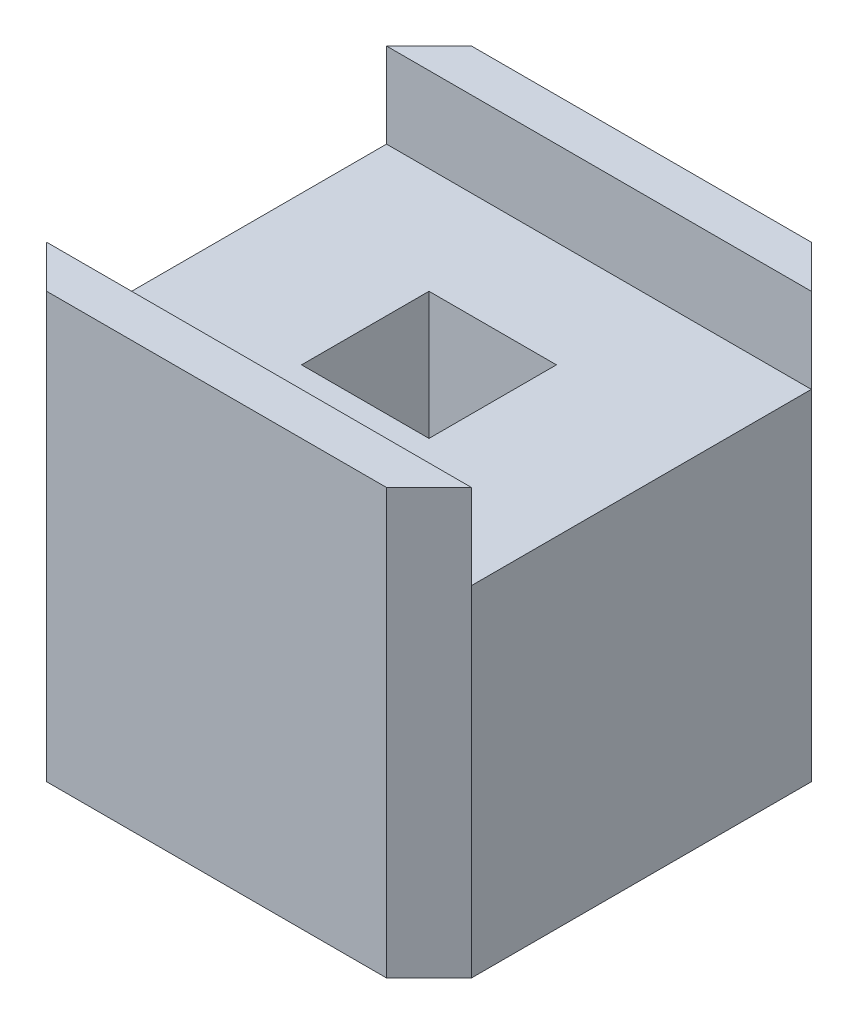
ISO-10303-21;
HEADER;
FILE_DESCRIPTION(('STEP AP214'),'2;1');
FILE_NAME('part.step','',(''),(''),'','','');
FILE_SCHEMA(('AUTOMOTIVE_DESIGN { 1 0 10303 214 1 1 1 1 }'));
ENDSEC;
DATA;
#1=APPLICATION_CONTEXT('core data for automotive mechanical design processes');
#2=APPLICATION_PROTOCOL_DEFINITION('international standard','automotive_design',2000,#1);
#3=PRODUCT_CONTEXT('',#1,'mechanical');
#4=PRODUCT('Part','Part','',(#3));
#5=PRODUCT_RELATED_PRODUCT_CATEGORY('part','',(#4));
#6=PRODUCT_DEFINITION_FORMATION('','',#4);
#7=PRODUCT_DEFINITION_CONTEXT('part definition',#1,'design');
#8=PRODUCT_DEFINITION('design','',#6,#7);
#9=PRODUCT_DEFINITION_SHAPE('','',#8);
#10=(LENGTH_UNIT() NAMED_UNIT(*) SI_UNIT(.MILLI.,.METRE.));
#11=(NAMED_UNIT(*) PLANE_ANGLE_UNIT() SI_UNIT($,.RADIAN.));
#12=(NAMED_UNIT(*) SI_UNIT($,.STERADIAN.) SOLID_ANGLE_UNIT());
#13=UNCERTAINTY_MEASURE_WITH_UNIT(LENGTH_MEASURE(1.E-05),#10,'distance_accuracy_value','');
#14=(GEOMETRIC_REPRESENTATION_CONTEXT(3) GLOBAL_UNCERTAINTY_ASSIGNED_CONTEXT((#13)) GLOBAL_UNIT_ASSIGNED_CONTEXT((#10,
#11,#12)) REPRESENTATION_CONTEXT('',''));
#15=CARTESIAN_POINT('',(0.,0.,0.));
#16=DIRECTION('',(0.,0.,1.));
#17=DIRECTION('',(1.,0.,0.));
#18=AXIS2_PLACEMENT_3D('',#15,#16,#17);
#19=CARTESIAN_POINT('',(0.,2.5,0.));
#20=DIRECTION('',(0.,-1.,0.));
#21=DIRECTION('',(0.,0.,-1.));
#22=AXIS2_PLACEMENT_3D('',#19,#20,#21);
#23=PLANE('',#22);
#24=DIRECTION('',(-0.707106781186548,0.,0.707106781186548));
#25=VECTOR('',#24,1.);
#26=CARTESIAN_POINT('',(-1.25,2.5,-1.));
#27=LINE('',#26,#25);
#28=CARTESIAN_POINT('',(-1.,2.5,-1.25));
#29=VERTEX_POINT('',#28);
#30=CARTESIAN_POINT('',(-1.25,2.5,-1.));
#31=VERTEX_POINT('',#30);
#32=EDGE_CURVE('E217',#29,#31,#27,.T.);
#33=ORIENTED_EDGE('',*,*,#32,.T.);
#34=DIRECTION('',(-1.,0.,0.));
#35=VECTOR('',#34,1.);
#36=CARTESIAN_POINT('',(-1.25,2.5,-1.));
#37=LINE('',#36,#35);
#38=CARTESIAN_POINT('',(1.25,2.5,-1.));
#39=VERTEX_POINT('',#38);
#40=EDGE_CURVE('E183',#39,#31,#37,.T.);
#41=ORIENTED_EDGE('',*,*,#40,.F.);
#42=DIRECTION('',(-0.707106781186548,0.,-0.707106781186548));
#43=VECTOR('',#42,1.);
#44=CARTESIAN_POINT('',(1.,2.5,-1.25));
#45=LINE('',#44,#43);
#46=CARTESIAN_POINT('',(1.,2.5,-1.25));
#47=VERTEX_POINT('',#46);
#48=EDGE_CURVE('E235',#39,#47,#45,.T.);
#49=ORIENTED_EDGE('',*,*,#48,.T.);
#50=DIRECTION('',(-1.,0.,0.));
#51=VECTOR('',#50,1.);
#52=CARTESIAN_POINT('',(-1.,2.5,-1.25));
#53=LINE('',#52,#51);
#54=EDGE_CURVE('E256',#47,#29,#53,.T.);
#55=ORIENTED_EDGE('',*,*,#54,.T.);
#56=EDGE_LOOP('',(#33,#41,#49,#55));
#57=FACE_BOUND('',#56,.T.);
#58=ADVANCED_FACE('F45',(#57),#23,.F.);
#59=CARTESIAN_POINT('',(-1.25,2.5,-1.));
#60=DIRECTION('',(1.,0.,0.));
#61=DIRECTION('',(0.,0.,-1.));
#62=AXIS2_PLACEMENT_3D('',#59,#60,#61);
#63=PLANE('',#62);
#64=DIRECTION('',(0.,0.,1.));
#65=VECTOR('',#64,1.);
#66=CARTESIAN_POINT('',(-1.25,2.,-1.));
#67=LINE('',#66,#65);
#68=CARTESIAN_POINT('',(-1.25,2.,-1.));
#69=VERTEX_POINT('',#68);
#70=CARTESIAN_POINT('',(-1.25,2.,1.));
#71=VERTEX_POINT('',#70);
#72=EDGE_CURVE('E175',#69,#71,#67,.T.);
#73=ORIENTED_EDGE('',*,*,#72,.F.);
#74=DIRECTION('',(0.,-1.,0.));
#75=VECTOR('',#74,1.);
#76=CARTESIAN_POINT('',(-1.25,2.5,-1.));
#77=LINE('',#76,#75);
#78=CARTESIAN_POINT('',(-1.25,0.,-1.));
#79=VERTEX_POINT('',#78);
#80=EDGE_CURVE('E200',#69,#79,#77,.T.);
#81=ORIENTED_EDGE('',*,*,#80,.T.);
#82=DIRECTION('',(0.,0.,1.));
#83=VECTOR('',#82,1.);
#84=CARTESIAN_POINT('',(-1.25,0.,-1.));
#85=LINE('',#84,#83);
#86=CARTESIAN_POINT('',(-1.25,0.,1.));
#87=VERTEX_POINT('',#86);
#88=EDGE_CURVE('E189',#79,#87,#85,.T.);
#89=ORIENTED_EDGE('',*,*,#88,.T.);
#90=DIRECTION('',(0.,-1.,0.));
#91=VECTOR('',#90,1.);
#92=CARTESIAN_POINT('',(-1.25,2.5,1.));
#93=LINE('',#92,#91);
#94=EDGE_CURVE('E186',#71,#87,#93,.T.);
#95=ORIENTED_EDGE('',*,*,#94,.F.);
#96=EDGE_LOOP('',(#73,#81,#89,#95));
#97=FACE_BOUND('',#96,.T.);
#98=ADVANCED_FACE('F187',(#97),#63,.F.);
#99=CARTESIAN_POINT('',(1.25,2.5,-1.));
#100=DIRECTION('',(-1.,0.,0.));
#101=DIRECTION('',(0.,0.,1.));
#102=AXIS2_PLACEMENT_3D('',#99,#100,#101);
#103=PLANE('',#102);
#104=DIRECTION('',(0.,0.,-1.));
#105=VECTOR('',#104,1.);
#106=CARTESIAN_POINT('',(1.25,2.,-1.));
#107=LINE('',#106,#105);
#108=CARTESIAN_POINT('',(1.25,2.,1.));
#109=VERTEX_POINT('',#108);
#110=CARTESIAN_POINT('',(1.25,2.,-1.));
#111=VERTEX_POINT('',#110);
#112=EDGE_CURVE('E174',#109,#111,#107,.T.);
#113=ORIENTED_EDGE('',*,*,#112,.F.);
#114=DIRECTION('',(0.,-1.,0.));
#115=VECTOR('',#114,1.);
#116=CARTESIAN_POINT('',(1.25,2.5,1.));
#117=LINE('',#116,#115);
#118=CARTESIAN_POINT('',(1.25,0.,1.));
#119=VERTEX_POINT('',#118);
#120=EDGE_CURVE('E262',#109,#119,#117,.T.);
#121=ORIENTED_EDGE('',*,*,#120,.T.);
#122=DIRECTION('',(0.,0.,-1.));
#123=VECTOR('',#122,1.);
#124=CARTESIAN_POINT('',(1.25,0.,-1.));
#125=LINE('',#124,#123);
#126=CARTESIAN_POINT('',(1.25,0.,-1.));
#127=VERTEX_POINT('',#126);
#128=EDGE_CURVE('E250',#119,#127,#125,.T.);
#129=ORIENTED_EDGE('',*,*,#128,.T.);
#130=DIRECTION('',(0.,-1.,0.));
#131=VECTOR('',#130,1.);
#132=CARTESIAN_POINT('',(1.25,2.5,-1.));
#133=LINE('',#132,#131);
#134=EDGE_CURVE('E258',#111,#127,#133,.T.);
#135=ORIENTED_EDGE('',*,*,#134,.F.);
#136=EDGE_LOOP('',(#113,#121,#129,#135));
#137=FACE_BOUND('',#136,.T.);
#138=ADVANCED_FACE('F340',(#137),#103,.F.);
#139=CARTESIAN_POINT('',(0.374999999999999,2.5,-0.375));
#140=DIRECTION('',(-1.,0.,0.));
#141=DIRECTION('',(0.,0.,1.));
#142=AXIS2_PLACEMENT_3D('',#139,#140,#141);
#143=PLANE('',#142);
#144=DIRECTION('',(0.,-1.,0.));
#145=VECTOR('',#144,1.);
#146=CARTESIAN_POINT('',(0.374999999999999,2.5,0.375));
#147=LINE('',#146,#145);
#148=CARTESIAN_POINT('',(0.374999999999999,2.,0.375));
#149=VERTEX_POINT('',#148);
#150=CARTESIAN_POINT('',(0.374999999999999,0.,0.375));
#151=VERTEX_POINT('',#150);
#152=EDGE_CURVE('E318',#149,#151,#147,.T.);
#153=ORIENTED_EDGE('',*,*,#152,.F.);
#154=DIRECTION('',(0.,0.,-1.));
#155=VECTOR('',#154,1.);
#156=CARTESIAN_POINT('',(0.374999999999999,2.,-0.375));
#157=LINE('',#156,#155);
#158=CARTESIAN_POINT('',(0.374999999999999,2.,-0.375));
#159=VERTEX_POINT('',#158);
#160=EDGE_CURVE('E72',#149,#159,#157,.T.);
#161=ORIENTED_EDGE('',*,*,#160,.T.);
#162=DIRECTION('',(0.,-1.,0.));
#163=VECTOR('',#162,1.);
#164=CARTESIAN_POINT('',(0.374999999999999,2.5,-0.375));
#165=LINE('',#164,#163);
#166=CARTESIAN_POINT('',(0.374999999999999,0.,-0.375));
#167=VERTEX_POINT('',#166);
#168=EDGE_CURVE('E228',#159,#167,#165,.T.);
#169=ORIENTED_EDGE('',*,*,#168,.T.);
#170=DIRECTION('',(0.,0.,-1.));
#171=VECTOR('',#170,1.);
#172=CARTESIAN_POINT('',(0.374999999999999,0.,-0.375));
#173=LINE('',#172,#171);
#174=EDGE_CURVE('E287',#151,#167,#173,.T.);
#175=ORIENTED_EDGE('',*,*,#174,.F.);
#176=EDGE_LOOP('',(#153,#161,#169,#175));
#177=FACE_BOUND('',#176,.T.);
#178=ADVANCED_FACE('F342',(#177),#143,.T.);
#179=CARTESIAN_POINT('',(-0.375000000000001,2.5,-0.375));
#180=DIRECTION('',(0.,0.,1.));
#181=DIRECTION('',(1.,0.,0.));
#182=AXIS2_PLACEMENT_3D('',#179,#180,#181);
#183=PLANE('',#182);
#184=ORIENTED_EDGE('',*,*,#168,.F.);
#185=DIRECTION('',(-1.,0.,0.));
#186=VECTOR('',#185,1.);
#187=CARTESIAN_POINT('',(-0.375000000000001,2.,-0.375));
#188=LINE('',#187,#186);
#189=CARTESIAN_POINT('',(-0.375000000000001,2.,-0.375));
#190=VERTEX_POINT('',#189);
#191=EDGE_CURVE('E288',#159,#190,#188,.T.);
#192=ORIENTED_EDGE('',*,*,#191,.T.);
#193=DIRECTION('',(0.,-1.,0.));
#194=VECTOR('',#193,1.);
#195=CARTESIAN_POINT('',(-0.375000000000001,2.5,-0.375));
#196=LINE('',#195,#194);
#197=CARTESIAN_POINT('',(-0.375000000000001,0.,-0.375));
#198=VERTEX_POINT('',#197);
#199=EDGE_CURVE('E232',#190,#198,#196,.T.);
#200=ORIENTED_EDGE('',*,*,#199,.T.);
#201=DIRECTION('',(-1.,0.,0.));
#202=VECTOR('',#201,1.);
#203=CARTESIAN_POINT('',(-0.375000000000001,0.,-0.375));
#204=LINE('',#203,#202);
#205=EDGE_CURVE('E306',#167,#198,#204,.T.);
#206=ORIENTED_EDGE('',*,*,#205,.F.);
#207=EDGE_LOOP('',(#184,#192,#200,#206));
#208=FACE_BOUND('',#207,.T.);
#209=ADVANCED_FACE('F348',(#208),#183,.T.);
#210=CARTESIAN_POINT('',(-0.375000000000001,2.5,-0.375));
#211=DIRECTION('',(1.,0.,0.));
#212=DIRECTION('',(0.,0.,-1.));
#213=AXIS2_PLACEMENT_3D('',#210,#211,#212);
#214=PLANE('',#213);
#215=ORIENTED_EDGE('',*,*,#199,.F.);
#216=DIRECTION('',(0.,0.,1.));
#217=VECTOR('',#216,1.);
#218=CARTESIAN_POINT('',(-0.375000000000001,2.,-0.375));
#219=LINE('',#218,#217);
#220=CARTESIAN_POINT('',(-0.375,2.,0.375));
#221=VERTEX_POINT('',#220);
#222=EDGE_CURVE('E290',#190,#221,#219,.T.);
#223=ORIENTED_EDGE('',*,*,#222,.T.);
#224=DIRECTION('',(0.,-1.,0.));
#225=VECTOR('',#224,1.);
#226=CARTESIAN_POINT('',(-0.375,2.5,0.375));
#227=LINE('',#226,#225);
#228=CARTESIAN_POINT('',(-0.375,0.,0.375));
#229=VERTEX_POINT('',#228);
#230=EDGE_CURVE('E321',#221,#229,#227,.T.);
#231=ORIENTED_EDGE('',*,*,#230,.T.);
#232=DIRECTION('',(0.,0.,1.));
#233=VECTOR('',#232,1.);
#234=CARTESIAN_POINT('',(-0.375000000000001,0.,-0.375));
#235=LINE('',#234,#233);
#236=EDGE_CURVE('E310',#198,#229,#235,.T.);
#237=ORIENTED_EDGE('',*,*,#236,.F.);
#238=EDGE_LOOP('',(#215,#223,#231,#237));
#239=FACE_BOUND('',#238,.T.);
#240=ADVANCED_FACE('F366',(#239),#214,.T.);
#241=CARTESIAN_POINT('',(-0.375,2.5,0.375));
#242=DIRECTION('',(0.,0.,-1.));
#243=DIRECTION('',(-1.,0.,0.));
#244=AXIS2_PLACEMENT_3D('',#241,#242,#243);
#245=PLANE('',#244);
#246=ORIENTED_EDGE('',*,*,#230,.F.);
#247=DIRECTION('',(1.,0.,0.));
#248=VECTOR('',#247,1.);
#249=CARTESIAN_POINT('',(-0.375,2.,0.375));
#250=LINE('',#249,#248);
#251=EDGE_CURVE('E11',#221,#149,#250,.T.);
#252=ORIENTED_EDGE('',*,*,#251,.T.);
#253=ORIENTED_EDGE('',*,*,#152,.T.);
#254=DIRECTION('',(1.,0.,0.));
#255=VECTOR('',#254,1.);
#256=CARTESIAN_POINT('',(-0.375,0.,0.375));
#257=LINE('',#256,#255);
#258=EDGE_CURVE('E314',#229,#151,#257,.T.);
#259=ORIENTED_EDGE('',*,*,#258,.F.);
#260=EDGE_LOOP('',(#246,#252,#253,#259));
#261=FACE_BOUND('',#260,.T.);
#262=ADVANCED_FACE('F361',(#261),#245,.T.);
#263=DIRECTION('',(0.707106781186548,0.,-0.707106781186548));
#264=VECTOR('',#263,1.);
#265=CARTESIAN_POINT('',(1.,2.5,1.25));
#266=LINE('',#265,#264);
#267=CARTESIAN_POINT('',(1.,2.5,1.25));
#268=VERTEX_POINT('',#267);
#269=CARTESIAN_POINT('',(1.25,2.5,1.));
#270=VERTEX_POINT('',#269);
#271=EDGE_CURVE('E331',#268,#270,#266,.T.);
#272=ORIENTED_EDGE('',*,*,#271,.T.);
#273=DIRECTION('',(1.,0.,0.));
#274=VECTOR('',#273,1.);
#275=CARTESIAN_POINT('',(-1.25,2.5,1.));
#276=LINE('',#275,#274);
#277=CARTESIAN_POINT('',(-1.25,2.5,1.));
#278=VERTEX_POINT('',#277);
#279=EDGE_CURVE('E395',#278,#270,#276,.T.);
#280=ORIENTED_EDGE('',*,*,#279,.F.);
#281=DIRECTION('',(0.707106781186548,0.,0.707106781186548));
#282=VECTOR('',#281,1.);
#283=CARTESIAN_POINT('',(-1.25,2.5,1.));
#284=LINE('',#283,#282);
#285=CARTESIAN_POINT('',(-1.,2.5,1.25));
#286=VERTEX_POINT('',#285);
#287=EDGE_CURVE('E198',#278,#286,#284,.T.);
#288=ORIENTED_EDGE('',*,*,#287,.T.);
#289=DIRECTION('',(1.,0.,0.));
#290=VECTOR('',#289,1.);
#291=CARTESIAN_POINT('',(-1.,2.5,1.25));
#292=LINE('',#291,#290);
#293=EDGE_CURVE('E277',#286,#268,#292,.T.);
#294=ORIENTED_EDGE('',*,*,#293,.T.);
#295=EDGE_LOOP('',(#272,#280,#288,#294));
#296=FACE_BOUND('',#295,.T.);
#297=ADVANCED_FACE('F356',(#296),#23,.F.);
#298=CARTESIAN_POINT('',(0.,0.,0.));
#299=DIRECTION('',(0.,-1.,0.));
#300=DIRECTION('',(0.,0.,-1.));
#301=AXIS2_PLACEMENT_3D('',#298,#299,#300);
#302=PLANE('',#301);
#303=DIRECTION('',(-1.,0.,0.));
#304=VECTOR('',#303,1.);
#305=CARTESIAN_POINT('',(-1.,0.,-1.25));
#306=LINE('',#305,#304);
#307=CARTESIAN_POINT('',(1.,0.,-1.25));
#308=VERTEX_POINT('',#307);
#309=CARTESIAN_POINT('',(-1.,0.,-1.25));
#310=VERTEX_POINT('',#309);
#311=EDGE_CURVE('E223',#308,#310,#306,.T.);
#312=ORIENTED_EDGE('',*,*,#311,.F.);
#313=DIRECTION('',(-0.707106781186548,0.,-0.707106781186548));
#314=VECTOR('',#313,1.);
#315=CARTESIAN_POINT('',(1.,0.,-1.25));
#316=LINE('',#315,#314);
#317=EDGE_CURVE('E254',#127,#308,#316,.T.);
#318=ORIENTED_EDGE('',*,*,#317,.F.);
#319=ORIENTED_EDGE('',*,*,#128,.F.);
#320=DIRECTION('',(0.707106781186548,0.,-0.707106781186548));
#321=VECTOR('',#320,1.);
#322=CARTESIAN_POINT('',(1.,0.,1.25));
#323=LINE('',#322,#321);
#324=CARTESIAN_POINT('',(1.,0.,1.25));
#325=VERTEX_POINT('',#324);
#326=EDGE_CURVE('E246',#325,#119,#323,.T.);
#327=ORIENTED_EDGE('',*,*,#326,.F.);
#328=DIRECTION('',(1.,0.,0.));
#329=VECTOR('',#328,1.);
#330=CARTESIAN_POINT('',(-1.,0.,1.25));
#331=LINE('',#330,#329);
#332=CARTESIAN_POINT('',(-1.,0.,1.25));
#333=VERTEX_POINT('',#332);
#334=EDGE_CURVE('E243',#333,#325,#331,.T.);
#335=ORIENTED_EDGE('',*,*,#334,.F.);
#336=DIRECTION('',(0.707106781186548,0.,0.707106781186548));
#337=VECTOR('',#336,1.);
#338=CARTESIAN_POINT('',(-1.25,0.,1.));
#339=LINE('',#338,#337);
#340=EDGE_CURVE('E240',#87,#333,#339,.T.);
#341=ORIENTED_EDGE('',*,*,#340,.F.);
#342=ORIENTED_EDGE('',*,*,#88,.F.);
#343=DIRECTION('',(-0.707106781186548,0.,0.707106781186548));
#344=VECTOR('',#343,1.);
#345=CARTESIAN_POINT('',(-1.25,0.,-1.));
#346=LINE('',#345,#344);
#347=EDGE_CURVE('E214',#310,#79,#346,.T.);
#348=ORIENTED_EDGE('',*,*,#347,.F.);
#349=EDGE_LOOP('',(#312,#318,#319,#327,#335,#341,#342,#348));
#350=FACE_BOUND('',#349,.T.);
#351=ORIENTED_EDGE('',*,*,#258,.T.);
#352=ORIENTED_EDGE('',*,*,#174,.T.);
#353=ORIENTED_EDGE('',*,*,#205,.T.);
#354=ORIENTED_EDGE('',*,*,#236,.T.);
#355=EDGE_LOOP('',(#351,#352,#353,#354));
#356=FACE_BOUND('',#355,.T.);
#357=ADVANCED_FACE('F278',(#350,#356),#302,.T.);
#358=CARTESIAN_POINT('',(-1.,2.5,-1.25));
#359=DIRECTION('',(0.,0.,1.));
#360=DIRECTION('',(1.,0.,0.));
#361=AXIS2_PLACEMENT_3D('',#358,#359,#360);
#362=PLANE('',#361);
#363=ORIENTED_EDGE('',*,*,#311,.T.);
#364=DIRECTION('',(0.,-1.,0.));
#365=VECTOR('',#364,1.);
#366=CARTESIAN_POINT('',(-1.,2.5,-1.25));
#367=LINE('',#366,#365);
#368=EDGE_CURVE('E54',#29,#310,#367,.T.);
#369=ORIENTED_EDGE('',*,*,#368,.F.);
#370=ORIENTED_EDGE('',*,*,#54,.F.);
#371=DIRECTION('',(0.,-1.,0.));
#372=VECTOR('',#371,1.);
#373=CARTESIAN_POINT('',(1.,2.5,-1.25));
#374=LINE('',#373,#372);
#375=EDGE_CURVE('E225',#47,#308,#374,.T.);
#376=ORIENTED_EDGE('',*,*,#375,.T.);
#377=EDGE_LOOP('',(#363,#369,#370,#376));
#378=FACE_BOUND('',#377,.T.);
#379=ADVANCED_FACE('F47',(#378),#362,.F.);
#380=CARTESIAN_POINT('',(-1.25,2.5,-1.));
#381=DIRECTION('',(0.707106781186548,0.,0.707106781186548));
#382=DIRECTION('',(0.707106781186548,0.,-0.707106781186548));
#383=AXIS2_PLACEMENT_3D('',#380,#381,#382);
#384=PLANE('',#383);
#385=ORIENTED_EDGE('',*,*,#347,.T.);
#386=ORIENTED_EDGE('',*,*,#80,.F.);
#387=EDGE_CURVE('E202',#31,#69,#77,.T.);
#388=ORIENTED_EDGE('',*,*,#387,.F.);
#389=ORIENTED_EDGE('',*,*,#32,.F.);
#390=ORIENTED_EDGE('',*,*,#368,.T.);
#391=EDGE_LOOP('',(#385,#386,#388,#389,#390));
#392=FACE_BOUND('',#391,.T.);
#393=ADVANCED_FACE('F213',(#392),#384,.F.);
#394=CARTESIAN_POINT('',(-1.25,2.5,1.));
#395=DIRECTION('',(0.707106781186548,0.,-0.707106781186548));
#396=DIRECTION('',(-0.707106781186548,0.,-0.707106781186548));
#397=AXIS2_PLACEMENT_3D('',#394,#395,#396);
#398=PLANE('',#397);
#399=ORIENTED_EDGE('',*,*,#340,.T.);
#400=DIRECTION('',(0.,-1.,0.));
#401=VECTOR('',#400,1.);
#402=CARTESIAN_POINT('',(-1.,2.5,1.25));
#403=LINE('',#402,#401);
#404=EDGE_CURVE('E193',#286,#333,#403,.T.);
#405=ORIENTED_EDGE('',*,*,#404,.F.);
#406=ORIENTED_EDGE('',*,*,#287,.F.);
#407=EDGE_CURVE('E167',#278,#71,#93,.T.);
#408=ORIENTED_EDGE('',*,*,#407,.T.);
#409=ORIENTED_EDGE('',*,*,#94,.T.);
#410=EDGE_LOOP('',(#399,#405,#406,#408,#409));
#411=FACE_BOUND('',#410,.T.);
#412=ADVANCED_FACE('F196',(#411),#398,.F.);
#413=CARTESIAN_POINT('',(-1.,2.5,1.25));
#414=DIRECTION('',(0.,0.,-1.));
#415=DIRECTION('',(-1.,0.,0.));
#416=AXIS2_PLACEMENT_3D('',#413,#414,#415);
#417=PLANE('',#416);
#418=ORIENTED_EDGE('',*,*,#334,.T.);
#419=DIRECTION('',(0.,-1.,0.));
#420=VECTOR('',#419,1.);
#421=CARTESIAN_POINT('',(1.,2.5,1.25));
#422=LINE('',#421,#420);
#423=EDGE_CURVE('E264',#268,#325,#422,.T.);
#424=ORIENTED_EDGE('',*,*,#423,.F.);
#425=ORIENTED_EDGE('',*,*,#293,.F.);
#426=ORIENTED_EDGE('',*,*,#404,.T.);
#427=EDGE_LOOP('',(#418,#424,#425,#426));
#428=FACE_BOUND('',#427,.T.);
#429=ADVANCED_FACE('F276',(#428),#417,.F.);
#430=CARTESIAN_POINT('',(1.,2.5,1.25));
#431=DIRECTION('',(-0.707106781186548,0.,-0.707106781186548));
#432=DIRECTION('',(-0.707106781186548,0.,0.707106781186548));
#433=AXIS2_PLACEMENT_3D('',#430,#431,#432);
#434=PLANE('',#433);
#435=ORIENTED_EDGE('',*,*,#326,.T.);
#436=ORIENTED_EDGE('',*,*,#120,.F.);
#437=EDGE_CURVE('E170',#270,#109,#117,.T.);
#438=ORIENTED_EDGE('',*,*,#437,.F.);
#439=ORIENTED_EDGE('',*,*,#271,.F.);
#440=ORIENTED_EDGE('',*,*,#423,.T.);
#441=EDGE_LOOP('',(#435,#436,#438,#439,#440));
#442=FACE_BOUND('',#441,.T.);
#443=ADVANCED_FACE('F282',(#442),#434,.F.);
#444=CARTESIAN_POINT('',(1.,2.5,-1.25));
#445=DIRECTION('',(-0.707106781186548,0.,0.707106781186548));
#446=DIRECTION('',(0.707106781186548,0.,0.707106781186548));
#447=AXIS2_PLACEMENT_3D('',#444,#445,#446);
#448=PLANE('',#447);
#449=ORIENTED_EDGE('',*,*,#317,.T.);
#450=ORIENTED_EDGE('',*,*,#375,.F.);
#451=ORIENTED_EDGE('',*,*,#48,.F.);
#452=EDGE_CURVE('E259',#39,#111,#133,.T.);
#453=ORIENTED_EDGE('',*,*,#452,.T.);
#454=ORIENTED_EDGE('',*,*,#134,.T.);
#455=EDGE_LOOP('',(#449,#450,#451,#453,#454));
#456=FACE_BOUND('',#455,.T.);
#457=ADVANCED_FACE('F338',(#456),#448,.F.);
#458=CARTESIAN_POINT('',(-1.25,2.,-1.));
#459=DIRECTION('',(0.,0.,-1.));
#460=DIRECTION('',(-1.,0.,0.));
#461=AXIS2_PLACEMENT_3D('',#458,#459,#460);
#462=PLANE('',#461);
#463=ORIENTED_EDGE('',*,*,#40,.T.);
#464=ORIENTED_EDGE('',*,*,#387,.T.);
#465=DIRECTION('',(-1.,0.,0.));
#466=VECTOR('',#465,1.);
#467=CARTESIAN_POINT('',(-1.25,2.,-1.));
#468=LINE('',#467,#466);
#469=EDGE_CURVE('E61',#111,#69,#468,.T.);
#470=ORIENTED_EDGE('',*,*,#469,.F.);
#471=ORIENTED_EDGE('',*,*,#452,.F.);
#472=EDGE_LOOP('',(#463,#464,#470,#471));
#473=FACE_BOUND('',#472,.T.);
#474=ADVANCED_FACE('F390',(#473),#462,.F.);
#475=CARTESIAN_POINT('',(-1.25,2.,1.));
#476=DIRECTION('',(0.,0.,1.));
#477=DIRECTION('',(1.,0.,0.));
#478=AXIS2_PLACEMENT_3D('',#475,#476,#477);
#479=PLANE('',#478);
#480=ORIENTED_EDGE('',*,*,#279,.T.);
#481=ORIENTED_EDGE('',*,*,#437,.T.);
#482=DIRECTION('',(1.,0.,0.));
#483=VECTOR('',#482,1.);
#484=CARTESIAN_POINT('',(-1.25,2.,1.));
#485=LINE('',#484,#483);
#486=EDGE_CURVE('E163',#71,#109,#485,.T.);
#487=ORIENTED_EDGE('',*,*,#486,.F.);
#488=ORIENTED_EDGE('',*,*,#407,.F.);
#489=EDGE_LOOP('',(#480,#481,#487,#488));
#490=FACE_BOUND('',#489,.T.);
#491=ADVANCED_FACE('F165',(#490),#479,.F.);
#492=CARTESIAN_POINT('',(0.,2.,0.));
#493=DIRECTION('',(0.,1.,0.));
#494=DIRECTION('',(0.,0.,1.));
#495=AXIS2_PLACEMENT_3D('',#492,#493,#494);
#496=PLANE('',#495);
#497=ORIENTED_EDGE('',*,*,#251,.F.);
#498=ORIENTED_EDGE('',*,*,#222,.F.);
#499=ORIENTED_EDGE('',*,*,#191,.F.);
#500=ORIENTED_EDGE('',*,*,#160,.F.);
#501=EDGE_LOOP('',(#497,#498,#499,#500));
#502=FACE_BOUND('',#501,.T.);
#503=ORIENTED_EDGE('',*,*,#72,.T.);
#504=ORIENTED_EDGE('',*,*,#486,.T.);
#505=ORIENTED_EDGE('',*,*,#112,.T.);
#506=ORIENTED_EDGE('',*,*,#469,.T.);
#507=EDGE_LOOP('',(#503,#504,#505,#506));
#508=FACE_BOUND('',#507,.T.);
#509=ADVANCED_FACE('F179',(#502,#508),#496,.T.);
#510=CLOSED_SHELL('',(#58,#98,#138,#178,#209,#240,#262,#297,#357,#379,#393,#412,#429,#443,#457,
#474,#491,#509));
#511=MANIFOLD_SOLID_BREP('B2',#510);
#512=ADVANCED_BREP_SHAPE_REPRESENTATION('',(#18,#511),#14);
#513=SHAPE_DEFINITION_REPRESENTATION(#9,#512);
ENDSEC;
END-ISO-10303-21;
